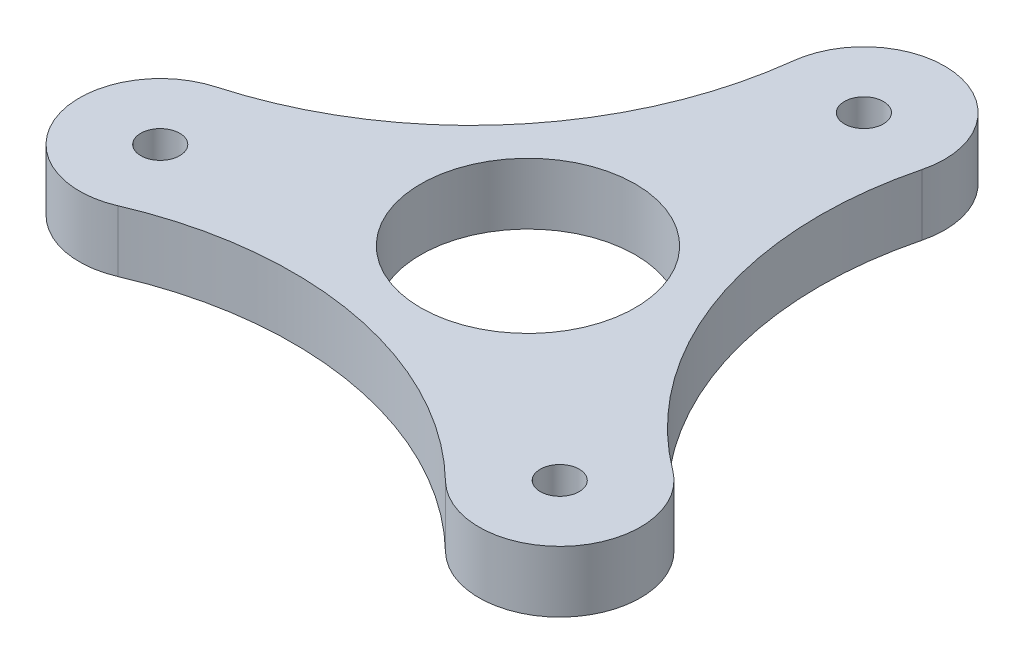
ISO-10303-21;
HEADER;
FILE_DESCRIPTION(('STEP AP214'),'2;1');
FILE_NAME('part.step','',(''),(''),'','','');
FILE_SCHEMA(('AUTOMOTIVE_DESIGN { 1 0 10303 214 1 1 1 1 }'));
ENDSEC;
DATA;
#1=APPLICATION_CONTEXT('core data for automotive mechanical design processes');
#2=APPLICATION_PROTOCOL_DEFINITION('international standard','automotive_design',2000,#1);
#3=PRODUCT_CONTEXT('',#1,'mechanical');
#4=PRODUCT('Part','Part','',(#3));
#5=PRODUCT_RELATED_PRODUCT_CATEGORY('part','',(#4));
#6=PRODUCT_DEFINITION_FORMATION('','',#4);
#7=PRODUCT_DEFINITION_CONTEXT('part definition',#1,'design');
#8=PRODUCT_DEFINITION('design','',#6,#7);
#9=PRODUCT_DEFINITION_SHAPE('','',#8);
#10=(LENGTH_UNIT() NAMED_UNIT(*) SI_UNIT(.MILLI.,.METRE.));
#11=(NAMED_UNIT(*) PLANE_ANGLE_UNIT() SI_UNIT($,.RADIAN.));
#12=(NAMED_UNIT(*) SI_UNIT($,.STERADIAN.) SOLID_ANGLE_UNIT());
#13=UNCERTAINTY_MEASURE_WITH_UNIT(LENGTH_MEASURE(1.E-05),#10,'distance_accuracy_value','');
#14=(GEOMETRIC_REPRESENTATION_CONTEXT(3) GLOBAL_UNCERTAINTY_ASSIGNED_CONTEXT((#13)) GLOBAL_UNIT_ASSIGNED_CONTEXT((#10,
#11,#12)) REPRESENTATION_CONTEXT('',''));
#15=CARTESIAN_POINT('',(0.,0.,0.));
#16=DIRECTION('',(0.,0.,1.));
#17=DIRECTION('',(1.,0.,0.));
#18=AXIS2_PLACEMENT_3D('',#15,#16,#17);
#19=CARTESIAN_POINT('',(482.666582878299,6.35,-1346.16357477581));
#20=DIRECTION('',(0.,1.,0.));
#21=DIRECTION('',(0.,0.,1.));
#22=AXIS2_PLACEMENT_3D('',#19,#20,#21);
#23=PLANE('',#22);
#24=CARTESIAN_POINT('',(522.974090799226,6.35,-1294.70372812017));
#25=DIRECTION('',(0.,1.,0.));
#26=DIRECTION('',(0.,0.,1.));
#27=AXIS2_PLACEMENT_3D('',#24,#25,#26);
#28=CIRCLE('',#27,2.0193000000007);
#29=CARTESIAN_POINT('',(522.974090799226,6.35,-1292.68442812017));
#30=VERTEX_POINT('',#29);
#31=EDGE_CURVE('E189',#30,#30,#28,.T.);
#32=ORIENTED_EDGE('',*,*,#31,.F.);
#33=EDGE_LOOP('',(#32));
#34=FACE_BOUND('',#33,.T.);
#35=CARTESIAN_POINT('',(505.741013858408,6.35,-1343.43968131852));
#36=DIRECTION('',(0.,1.,0.));
#37=DIRECTION('',(0.,0.,1.));
#38=AXIS2_PLACEMENT_3D('',#35,#36,#37);
#39=CIRCLE('',#38,2.01929999999806);
#40=CARTESIAN_POINT('',(505.741013858408,6.35,-1341.42038131852));
#41=VERTEX_POINT('',#40);
#42=EDGE_CURVE('E122',#41,#41,#39,.T.);
#43=ORIENTED_EDGE('',*,*,#42,.F.);
#44=EDGE_LOOP('',(#43));
#45=FACE_BOUND('',#44,.T.);
#46=CARTESIAN_POINT('',(459.59215189819,6.35,-1348.8874682331));
#47=DIRECTION('',(0.,-1.,0.));
#48=DIRECTION('',(0.,0.,1.));
#49=AXIS2_PLACEMENT_3D('',#46,#47,#48);
#50=CIRCLE('',#49,38.0999999999999);
#51=CARTESIAN_POINT('',(497.429425984185,6.35,-1344.42084873495));
#52=VERTEX_POINT('',#51);
#53=CARTESIAN_POINT('',(469.889085664141,6.35,-1312.20527698149));
#54=VERTEX_POINT('',#53);
#55=EDGE_CURVE('E129',#52,#54,#50,.T.);
#56=ORIENTED_EDGE('',*,*,#55,.T.);
#57=CARTESIAN_POINT('',(472.150978781395,6.35,-1304.14742230322));
#58=DIRECTION('',(0.,1.,0.));
#59=DIRECTION('',(0.,0.,1.));
#60=AXIS2_PLACEMENT_3D('',#57,#58,#59);
#61=CIRCLE('',#60,8.36930000000012);
#62=CARTESIAN_POINT('',(475.457056810515,6.35,-1296.45879235014));
#63=VERTEX_POINT('',#62);
#64=EDGE_CURVE('E87',#54,#63,#61,.T.);
#65=ORIENTED_EDGE('',*,*,#64,.T.);
#66=CARTESIAN_POINT('',(490.507487899071,6.35,-1261.45744203264));
#67=DIRECTION('',(0.,-1.,0.));
#68=DIRECTION('',(0.,0.,-1.));
#69=AXIS2_PLACEMENT_3D('',#66,#67,#68);
#70=CIRCLE('',#69,38.1000000000001);
#71=CARTESIAN_POINT('',(517.126730506468,6.35,-1288.71594388085));
#72=VERTEX_POINT('',#71);
#73=EDGE_CURVE('E100',#63,#72,#70,.T.);
#74=ORIENTED_EDGE('',*,*,#73,.T.);
#75=CARTESIAN_POINT('',(522.974090799226,6.35,-1294.70372812017));
#76=DIRECTION('',(0.,1.,0.));
#77=DIRECTION('',(0.,0.,1.));
#78=AXIS2_PLACEMENT_3D('',#75,#76,#77);
#79=CIRCLE('',#78,8.36929999999957);
#80=CARTESIAN_POINT('',(527.979600644329,6.35,-1301.41119065682));
#81=VERTEX_POINT('',#80);
#82=EDGE_CURVE('E94',#72,#81,#79,.T.);
#83=ORIENTED_EDGE('',*,*,#82,.T.);
#84=CARTESIAN_POINT('',(550.766443641768,6.35,-1331.94592147617));
#85=DIRECTION('',(0.,-1.,0.));
#86=DIRECTION('',(0.,0.,-1.));
#87=AXIS2_PLACEMENT_3D('',#84,#85,#86);
#88=CIRCLE('',#87,38.1);
#89=CARTESIAN_POINT('',(513.85026726842,6.35,-1341.36961087957));
#90=VERTEX_POINT('',#89);
#91=EDGE_CURVE('E98',#81,#90,#88,.T.);
#92=ORIENTED_EDGE('',*,*,#91,.T.);
#93=CARTESIAN_POINT('',(505.741013858408,6.35,-1343.43968131852));
#94=DIRECTION('',(0.,1.,0.));
#95=DIRECTION('',(0.,0.,1.));
#96=AXIS2_PLACEMENT_3D('',#93,#94,#95);
#97=CIRCLE('',#96,8.3692999999995);
#98=EDGE_CURVE('E50',#90,#52,#97,.T.);
#99=ORIENTED_EDGE('',*,*,#98,.T.);
#100=EDGE_LOOP('',(#56,#65,#74,#83,#92,#99));
#101=FACE_BOUND('',#100,.T.);
#102=CARTESIAN_POINT('',(500.288694479676,6.35,-1314.09694391397));
#103=DIRECTION('',(0.,1.,0.));
#104=DIRECTION('',(0.,0.,1.));
#105=AXIS2_PLACEMENT_3D('',#102,#103,#104);
#106=CIRCLE('',#105,11.1124999999999);
#107=CARTESIAN_POINT('',(500.288694479676,6.35,-1302.98444391397));
#108=VERTEX_POINT('',#107);
#109=EDGE_CURVE('E195',#108,#108,#106,.T.);
#110=ORIENTED_EDGE('',*,*,#109,.F.);
#111=EDGE_LOOP('',(#110));
#112=FACE_BOUND('',#111,.T.);
#113=CARTESIAN_POINT('',(472.150978781395,6.35,-1304.14742230322));
#114=DIRECTION('',(0.,1.,0.));
#115=DIRECTION('',(0.,0.,1.));
#116=AXIS2_PLACEMENT_3D('',#113,#114,#115);
#117=CIRCLE('',#116,2.01930000000017);
#118=CARTESIAN_POINT('',(472.150978781395,6.35,-1302.12812230322));
#119=VERTEX_POINT('',#118);
#120=EDGE_CURVE('E180',#119,#119,#117,.T.);
#121=ORIENTED_EDGE('',*,*,#120,.F.);
#122=EDGE_LOOP('',(#121));
#123=FACE_BOUND('',#122,.T.);
#124=ADVANCED_FACE('F33',(#34,#45,#101,#112,#123),#23,.T.);
#125=CARTESIAN_POINT('',(482.666582878299,0.,-1346.16357477581));
#126=DIRECTION('',(0.,1.,0.));
#127=DIRECTION('',(0.,0.,1.));
#128=AXIS2_PLACEMENT_3D('',#125,#126,#127);
#129=PLANE('',#128);
#130=CARTESIAN_POINT('',(459.59215189819,0.,-1348.8874682331));
#131=DIRECTION('',(0.,-1.,0.));
#132=DIRECTION('',(0.,0.,1.));
#133=AXIS2_PLACEMENT_3D('',#130,#131,#132);
#134=CIRCLE('',#133,38.0999999999999);
#135=CARTESIAN_POINT('',(497.429425984185,0.,-1344.42084873495));
#136=VERTEX_POINT('',#135);
#137=CARTESIAN_POINT('',(469.889085664141,0.,-1312.20527698149));
#138=VERTEX_POINT('',#137);
#139=EDGE_CURVE('E118',#136,#138,#134,.T.);
#140=ORIENTED_EDGE('',*,*,#139,.F.);
#141=CARTESIAN_POINT('',(505.741013858408,0.,-1343.43968131852));
#142=DIRECTION('',(0.,1.,0.));
#143=DIRECTION('',(0.,0.,1.));
#144=AXIS2_PLACEMENT_3D('',#141,#142,#143);
#145=CIRCLE('',#144,8.3692999999995);
#146=CARTESIAN_POINT('',(513.85026726842,0.,-1341.36961087957));
#147=VERTEX_POINT('',#146);
#148=EDGE_CURVE('E79',#147,#136,#145,.T.);
#149=ORIENTED_EDGE('',*,*,#148,.F.);
#150=CARTESIAN_POINT('',(550.766443641768,0.,-1331.94592147617));
#151=DIRECTION('',(0.,-1.,0.));
#152=DIRECTION('',(0.,0.,-1.));
#153=AXIS2_PLACEMENT_3D('',#150,#151,#152);
#154=CIRCLE('',#153,38.1);
#155=CARTESIAN_POINT('',(527.979600644329,0.,-1301.41119065682));
#156=VERTEX_POINT('',#155);
#157=EDGE_CURVE('E73',#156,#147,#154,.T.);
#158=ORIENTED_EDGE('',*,*,#157,.F.);
#159=CARTESIAN_POINT('',(522.974090799226,0.,-1294.70372812017));
#160=DIRECTION('',(0.,1.,0.));
#161=DIRECTION('',(0.,0.,1.));
#162=AXIS2_PLACEMENT_3D('',#159,#160,#161);
#163=CIRCLE('',#162,8.36929999999957);
#164=CARTESIAN_POINT('',(517.126730506468,0.,-1288.71594388085));
#165=VERTEX_POINT('',#164);
#166=EDGE_CURVE('E108',#165,#156,#163,.T.);
#167=ORIENTED_EDGE('',*,*,#166,.F.);
#168=CARTESIAN_POINT('',(490.507487899071,0.,-1261.45744203264));
#169=DIRECTION('',(0.,-1.,0.));
#170=DIRECTION('',(0.,0.,-1.));
#171=AXIS2_PLACEMENT_3D('',#168,#169,#170);
#172=CIRCLE('',#171,38.1000000000001);
#173=CARTESIAN_POINT('',(475.457056810515,0.,-1296.45879235014));
#174=VERTEX_POINT('',#173);
#175=EDGE_CURVE('E124',#174,#165,#172,.T.);
#176=ORIENTED_EDGE('',*,*,#175,.F.);
#177=CARTESIAN_POINT('',(472.150978781395,0.,-1304.14742230322));
#178=DIRECTION('',(0.,1.,0.));
#179=DIRECTION('',(0.,0.,1.));
#180=AXIS2_PLACEMENT_3D('',#177,#178,#179);
#181=CIRCLE('',#180,8.36930000000012);
#182=EDGE_CURVE('E121',#138,#174,#181,.T.);
#183=ORIENTED_EDGE('',*,*,#182,.F.);
#184=EDGE_LOOP('',(#140,#149,#158,#167,#176,#183));
#185=FACE_BOUND('',#184,.T.);
#186=CARTESIAN_POINT('',(505.741013858408,0.,-1343.43968131852));
#187=DIRECTION('',(0.,1.,0.));
#188=DIRECTION('',(0.,0.,1.));
#189=AXIS2_PLACEMENT_3D('',#186,#187,#188);
#190=CIRCLE('',#189,2.01929999999806);
#191=CARTESIAN_POINT('',(505.741013858408,0.,-1341.42038131852));
#192=VERTEX_POINT('',#191);
#193=EDGE_CURVE('E198',#192,#192,#190,.T.);
#194=ORIENTED_EDGE('',*,*,#193,.T.);
#195=EDGE_LOOP('',(#194));
#196=FACE_BOUND('',#195,.T.);
#197=CARTESIAN_POINT('',(500.288694479676,0.,-1314.09694391397));
#198=DIRECTION('',(0.,1.,0.));
#199=DIRECTION('',(0.,0.,1.));
#200=AXIS2_PLACEMENT_3D('',#197,#198,#199);
#201=CIRCLE('',#200,11.1124999999999);
#202=CARTESIAN_POINT('',(500.288694479676,0.,-1302.98444391397));
#203=VERTEX_POINT('',#202);
#204=EDGE_CURVE('E192',#203,#203,#201,.T.);
#205=ORIENTED_EDGE('',*,*,#204,.T.);
#206=EDGE_LOOP('',(#205));
#207=FACE_BOUND('',#206,.T.);
#208=CARTESIAN_POINT('',(522.974090799226,0.,-1294.70372812017));
#209=DIRECTION('',(0.,1.,0.));
#210=DIRECTION('',(0.,0.,1.));
#211=AXIS2_PLACEMENT_3D('',#208,#209,#210);
#212=CIRCLE('',#211,2.0193000000007);
#213=CARTESIAN_POINT('',(522.974090799226,0.,-1292.68442812017));
#214=VERTEX_POINT('',#213);
#215=EDGE_CURVE('E186',#214,#214,#212,.T.);
#216=ORIENTED_EDGE('',*,*,#215,.T.);
#217=EDGE_LOOP('',(#216));
#218=FACE_BOUND('',#217,.T.);
#219=CARTESIAN_POINT('',(472.150978781395,0.,-1304.14742230322));
#220=DIRECTION('',(0.,1.,0.));
#221=DIRECTION('',(0.,0.,1.));
#222=AXIS2_PLACEMENT_3D('',#219,#220,#221);
#223=CIRCLE('',#222,2.01930000000017);
#224=CARTESIAN_POINT('',(472.150978781395,0.,-1302.12812230322));
#225=VERTEX_POINT('',#224);
#226=EDGE_CURVE('E183',#225,#225,#223,.T.);
#227=ORIENTED_EDGE('',*,*,#226,.T.);
#228=EDGE_LOOP('',(#227));
#229=FACE_BOUND('',#228,.T.);
#230=ADVANCED_FACE('F138',(#185,#196,#207,#218,#229),#129,.F.);
#231=CARTESIAN_POINT('',(459.59215189819,6.35,-1348.8874682331));
#232=DIRECTION('',(0.,-1.,0.));
#233=DIRECTION('',(0.,0.,-1.));
#234=AXIS2_PLACEMENT_3D('',#231,#232,#233);
#235=CYLINDRICAL_SURFACE('',#234,38.0999999999999);
#236=ORIENTED_EDGE('',*,*,#139,.T.);
#237=DIRECTION('',(0.,-1.,0.));
#238=VECTOR('',#237,1.);
#239=CARTESIAN_POINT('',(469.889085664141,6.35,-1312.20527698149));
#240=LINE('',#239,#238);
#241=EDGE_CURVE('E11',#54,#138,#240,.T.);
#242=ORIENTED_EDGE('',*,*,#241,.F.);
#243=ORIENTED_EDGE('',*,*,#55,.F.);
#244=DIRECTION('',(0.,-1.,0.));
#245=VECTOR('',#244,1.);
#246=CARTESIAN_POINT('',(497.429425984185,6.35,-1344.42084873495));
#247=LINE('',#246,#245);
#248=EDGE_CURVE('E114',#52,#136,#247,.T.);
#249=ORIENTED_EDGE('',*,*,#248,.T.);
#250=EDGE_LOOP('',(#236,#242,#243,#249));
#251=FACE_BOUND('',#250,.T.);
#252=ADVANCED_FACE('F35',(#251),#235,.F.);
#253=CARTESIAN_POINT('',(472.150978781395,6.35,-1304.14742230322));
#254=DIRECTION('',(0.,-1.,0.));
#255=DIRECTION('',(0.,0.,-1.));
#256=AXIS2_PLACEMENT_3D('',#253,#254,#255);
#257=CYLINDRICAL_SURFACE('',#256,8.36930000000012);
#258=ORIENTED_EDGE('',*,*,#182,.T.);
#259=DIRECTION('',(0.,-1.,0.));
#260=VECTOR('',#259,1.);
#261=CARTESIAN_POINT('',(475.457056810515,6.35,-1296.45879235014));
#262=LINE('',#261,#260);
#263=EDGE_CURVE('E42',#63,#174,#262,.T.);
#264=ORIENTED_EDGE('',*,*,#263,.F.);
#265=ORIENTED_EDGE('',*,*,#64,.F.);
#266=ORIENTED_EDGE('',*,*,#241,.T.);
#267=EDGE_LOOP('',(#258,#264,#265,#266));
#268=FACE_BOUND('',#267,.T.);
#269=ADVANCED_FACE('F256',(#268),#257,.T.);
#270=CARTESIAN_POINT('',(490.507487899071,6.35,-1261.45744203264));
#271=DIRECTION('',(0.,-1.,0.));
#272=DIRECTION('',(0.,0.,-1.));
#273=AXIS2_PLACEMENT_3D('',#270,#271,#272);
#274=CYLINDRICAL_SURFACE('',#273,38.1000000000001);
#275=ORIENTED_EDGE('',*,*,#175,.T.);
#276=DIRECTION('',(0.,-1.,0.));
#277=VECTOR('',#276,1.);
#278=CARTESIAN_POINT('',(517.126730506468,6.35,-1288.71594388085));
#279=LINE('',#278,#277);
#280=EDGE_CURVE('E109',#72,#165,#279,.T.);
#281=ORIENTED_EDGE('',*,*,#280,.F.);
#282=ORIENTED_EDGE('',*,*,#73,.F.);
#283=ORIENTED_EDGE('',*,*,#263,.T.);
#284=EDGE_LOOP('',(#275,#281,#282,#283));
#285=FACE_BOUND('',#284,.T.);
#286=ADVANCED_FACE('F135',(#285),#274,.F.);
#287=CARTESIAN_POINT('',(522.974090799226,6.35,-1294.70372812017));
#288=DIRECTION('',(0.,-1.,0.));
#289=DIRECTION('',(0.,0.,-1.));
#290=AXIS2_PLACEMENT_3D('',#287,#288,#289);
#291=CYLINDRICAL_SURFACE('',#290,8.36929999999957);
#292=ORIENTED_EDGE('',*,*,#166,.T.);
#293=DIRECTION('',(0.,-1.,0.));
#294=VECTOR('',#293,1.);
#295=CARTESIAN_POINT('',(527.979600644329,6.35,-1301.41119065682));
#296=LINE('',#295,#294);
#297=EDGE_CURVE('E105',#81,#156,#296,.T.);
#298=ORIENTED_EDGE('',*,*,#297,.F.);
#299=ORIENTED_EDGE('',*,*,#82,.F.);
#300=ORIENTED_EDGE('',*,*,#280,.T.);
#301=EDGE_LOOP('',(#292,#298,#299,#300));
#302=FACE_BOUND('',#301,.T.);
#303=ADVANCED_FACE('F106',(#302),#291,.T.);
#304=CARTESIAN_POINT('',(550.766443641768,6.35,-1331.94592147617));
#305=DIRECTION('',(0.,-1.,0.));
#306=DIRECTION('',(0.,0.,-1.));
#307=AXIS2_PLACEMENT_3D('',#304,#305,#306);
#308=CYLINDRICAL_SURFACE('',#307,38.1);
#309=ORIENTED_EDGE('',*,*,#157,.T.);
#310=DIRECTION('',(0.,-1.,0.));
#311=VECTOR('',#310,1.);
#312=CARTESIAN_POINT('',(513.85026726842,6.35,-1341.36961087957));
#313=LINE('',#312,#311);
#314=EDGE_CURVE('E110',#90,#147,#313,.T.);
#315=ORIENTED_EDGE('',*,*,#314,.F.);
#316=ORIENTED_EDGE('',*,*,#91,.F.);
#317=ORIENTED_EDGE('',*,*,#297,.T.);
#318=EDGE_LOOP('',(#309,#315,#316,#317));
#319=FACE_BOUND('',#318,.T.);
#320=ADVANCED_FACE('F112',(#319),#308,.F.);
#321=CARTESIAN_POINT('',(505.741013858408,6.35,-1343.43968131852));
#322=DIRECTION('',(0.,-1.,0.));
#323=DIRECTION('',(0.,0.,-1.));
#324=AXIS2_PLACEMENT_3D('',#321,#322,#323);
#325=CYLINDRICAL_SURFACE('',#324,8.3692999999995);
#326=ORIENTED_EDGE('',*,*,#148,.T.);
#327=ORIENTED_EDGE('',*,*,#248,.F.);
#328=ORIENTED_EDGE('',*,*,#98,.F.);
#329=ORIENTED_EDGE('',*,*,#314,.T.);
#330=EDGE_LOOP('',(#326,#327,#328,#329));
#331=FACE_BOUND('',#330,.T.);
#332=ADVANCED_FACE('F143',(#331),#325,.T.);
#333=CARTESIAN_POINT('',(505.741013858408,6.35,-1343.43968131852));
#334=DIRECTION('',(0.,-1.,0.));
#335=DIRECTION('',(0.,0.,-1.));
#336=AXIS2_PLACEMENT_3D('',#333,#334,#335);
#337=CYLINDRICAL_SURFACE('',#336,2.01929999999806);
#338=ORIENTED_EDGE('',*,*,#42,.T.);
#339=EDGE_LOOP('',(#338));
#340=FACE_BOUND('',#339,.T.);
#341=ORIENTED_EDGE('',*,*,#193,.F.);
#342=EDGE_LOOP('',(#341));
#343=FACE_BOUND('',#342,.T.);
#344=ADVANCED_FACE('F145',(#340,#343),#337,.F.);
#345=CARTESIAN_POINT('',(500.288694479676,6.35,-1314.09694391397));
#346=DIRECTION('',(0.,-1.,0.));
#347=DIRECTION('',(0.,0.,-1.));
#348=AXIS2_PLACEMENT_3D('',#345,#346,#347);
#349=CYLINDRICAL_SURFACE('',#348,11.1124999999999);
#350=ORIENTED_EDGE('',*,*,#109,.T.);
#351=EDGE_LOOP('',(#350));
#352=FACE_BOUND('',#351,.T.);
#353=ORIENTED_EDGE('',*,*,#204,.F.);
#354=EDGE_LOOP('',(#353));
#355=FACE_BOUND('',#354,.T.);
#356=ADVANCED_FACE('F151',(#352,#355),#349,.F.);
#357=CARTESIAN_POINT('',(522.974090799226,6.35,-1294.70372812017));
#358=DIRECTION('',(0.,-1.,0.));
#359=DIRECTION('',(0.,0.,-1.));
#360=AXIS2_PLACEMENT_3D('',#357,#358,#359);
#361=CYLINDRICAL_SURFACE('',#360,2.0193000000007);
#362=ORIENTED_EDGE('',*,*,#31,.T.);
#363=EDGE_LOOP('',(#362));
#364=FACE_BOUND('',#363,.T.);
#365=ORIENTED_EDGE('',*,*,#215,.F.);
#366=EDGE_LOOP('',(#365));
#367=FACE_BOUND('',#366,.T.);
#368=ADVANCED_FACE('F167',(#364,#367),#361,.F.);
#369=CARTESIAN_POINT('',(472.150978781395,6.35,-1304.14742230322));
#370=DIRECTION('',(0.,-1.,0.));
#371=DIRECTION('',(0.,0.,-1.));
#372=AXIS2_PLACEMENT_3D('',#369,#370,#371);
#373=CYLINDRICAL_SURFACE('',#372,2.01930000000017);
#374=ORIENTED_EDGE('',*,*,#120,.T.);
#375=EDGE_LOOP('',(#374));
#376=FACE_BOUND('',#375,.T.);
#377=ORIENTED_EDGE('',*,*,#226,.F.);
#378=EDGE_LOOP('',(#377));
#379=FACE_BOUND('',#378,.T.);
#380=ADVANCED_FACE('F171',(#376,#379),#373,.F.);
#381=CLOSED_SHELL('',(#124,#230,#252,#269,#286,#303,#320,#332,#344,#356,#368,#380));
#382=MANIFOLD_SOLID_BREP('B2',#381);
#383=ADVANCED_BREP_SHAPE_REPRESENTATION('',(#18,#382),#14);
#384=SHAPE_DEFINITION_REPRESENTATION(#9,#383);
ENDSEC;
END-ISO-10303-21;
